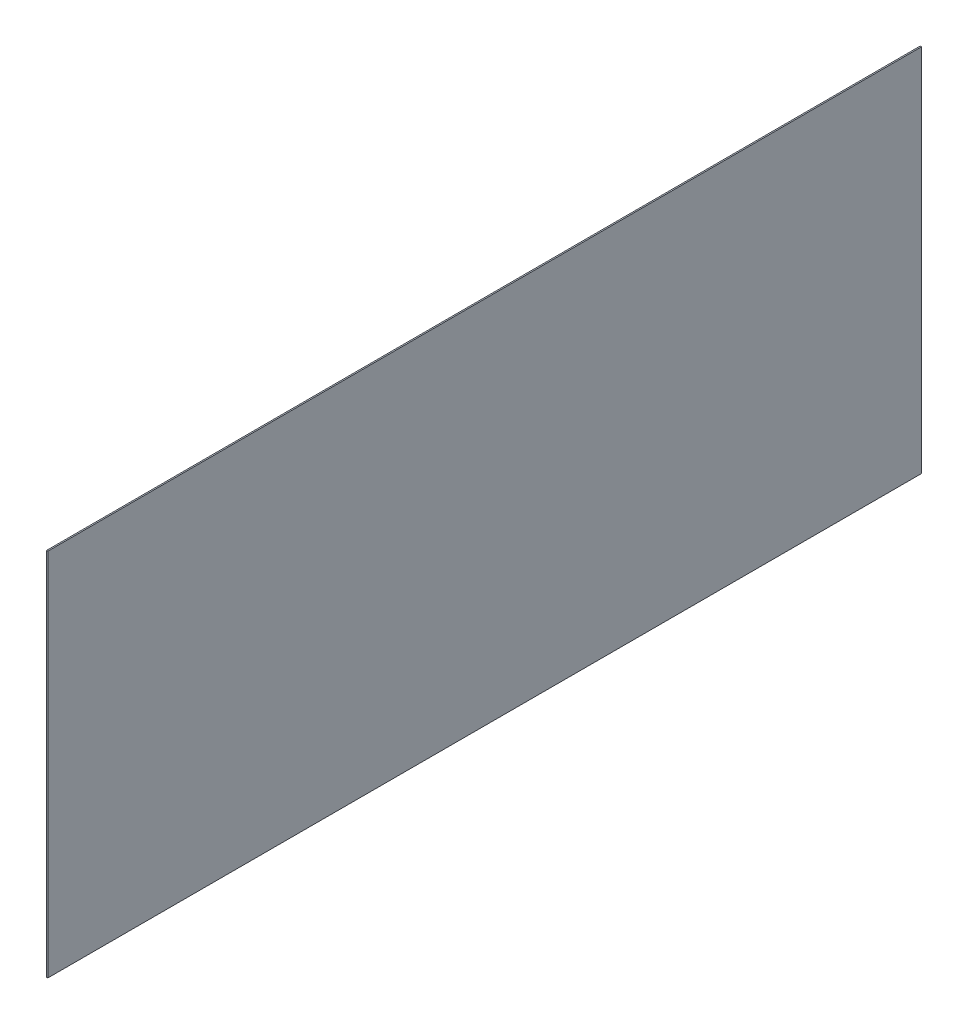
ISO-10303-21;
HEADER;
FILE_DESCRIPTION(('STEP AP214'),'2;1');
FILE_NAME('part.step','',(''),(''),'','','');
FILE_SCHEMA(('AUTOMOTIVE_DESIGN { 1 0 10303 214 1 1 1 1 }'));
ENDSEC;
DATA;
#1=APPLICATION_CONTEXT('core data for automotive mechanical design processes');
#2=APPLICATION_PROTOCOL_DEFINITION('international standard','automotive_design',2000,#1);
#3=PRODUCT_CONTEXT('',#1,'mechanical');
#4=PRODUCT('Part','Part','',(#3));
#5=PRODUCT_RELATED_PRODUCT_CATEGORY('part','',(#4));
#6=PRODUCT_DEFINITION_FORMATION('','',#4);
#7=PRODUCT_DEFINITION_CONTEXT('part definition',#1,'design');
#8=PRODUCT_DEFINITION('design','',#6,#7);
#9=PRODUCT_DEFINITION_SHAPE('','',#8);
#10=(LENGTH_UNIT() NAMED_UNIT(*) SI_UNIT(.MILLI.,.METRE.));
#11=(NAMED_UNIT(*) PLANE_ANGLE_UNIT() SI_UNIT($,.RADIAN.));
#12=(NAMED_UNIT(*) SI_UNIT($,.STERADIAN.) SOLID_ANGLE_UNIT());
#13=UNCERTAINTY_MEASURE_WITH_UNIT(LENGTH_MEASURE(1.E-05),#10,'distance_accuracy_value','');
#14=(GEOMETRIC_REPRESENTATION_CONTEXT(3) GLOBAL_UNCERTAINTY_ASSIGNED_CONTEXT((#13)) GLOBAL_UNIT_ASSIGNED_CONTEXT((#10,
#11,#12)) REPRESENTATION_CONTEXT('',''));
#15=CARTESIAN_POINT('',(0.,0.,0.));
#16=DIRECTION('',(0.,0.,1.));
#17=DIRECTION('',(1.,0.,0.));
#18=AXIS2_PLACEMENT_3D('',#15,#16,#17);
#19=CARTESIAN_POINT('',(99.95,21.3610949304939,-23.1263772325031));
#20=DIRECTION('',(0.,0.,1.));
#21=DIRECTION('',(1.,0.,0.));
#22=AXIS2_PLACEMENT_3D('',#19,#20,#21);
#23=PLANE('',#22);
#24=DIRECTION('',(0.,-1.,0.));
#25=VECTOR('',#24,1.);
#26=CARTESIAN_POINT('',(100.05,21.3610949304939,-23.1263772325031));
#27=LINE('',#26,#25);
#28=CARTESIAN_POINT('',(100.05,21.3610949304939,-23.1263772325031));
#29=VERTEX_POINT('',#28);
#30=CARTESIAN_POINT('',(100.05,-6.93992942841096,-23.1263772325031));
#31=VERTEX_POINT('',#30);
#32=EDGE_CURVE('E98',#29,#31,#27,.T.);
#33=ORIENTED_EDGE('',*,*,#32,.T.);
#34=DIRECTION('',(1.,0.,0.));
#35=VECTOR('',#34,1.);
#36=CARTESIAN_POINT('',(99.95,-6.93992942841096,-23.1263772325031));
#37=LINE('',#36,#35);
#38=CARTESIAN_POINT('',(99.95,-6.93992942841096,-23.1263772325031));
#39=VERTEX_POINT('',#38);
#40=EDGE_CURVE('E11',#39,#31,#37,.T.);
#41=ORIENTED_EDGE('',*,*,#40,.F.);
#42=DIRECTION('',(0.,-1.,0.));
#43=VECTOR('',#42,1.);
#44=CARTESIAN_POINT('',(99.95,21.3610949304939,-23.1263772325031));
#45=LINE('',#44,#43);
#46=CARTESIAN_POINT('',(99.95,21.3610949304939,-23.1263772325031));
#47=VERTEX_POINT('',#46);
#48=EDGE_CURVE('E86',#47,#39,#45,.T.);
#49=ORIENTED_EDGE('',*,*,#48,.F.);
#50=DIRECTION('',(1.,0.,0.));
#51=VECTOR('',#50,1.);
#52=CARTESIAN_POINT('',(99.95,21.3610949304939,-23.1263772325031));
#53=LINE('',#52,#51);
#54=EDGE_CURVE('E94',#47,#29,#53,.T.);
#55=ORIENTED_EDGE('',*,*,#54,.T.);
#56=EDGE_LOOP('',(#33,#41,#49,#55));
#57=FACE_BOUND('',#56,.T.);
#58=ADVANCED_FACE('F35',(#57),#23,.F.);
#59=CARTESIAN_POINT('',(99.95,-6.93992942841096,-23.1263772325031));
#60=DIRECTION('',(0.,1.,0.));
#61=DIRECTION('',(0.,0.,1.));
#62=AXIS2_PLACEMENT_3D('',#59,#60,#61);
#63=PLANE('',#62);
#64=DIRECTION('',(0.,0.,1.));
#65=VECTOR('',#64,1.);
#66=CARTESIAN_POINT('',(100.05,-6.93992942841096,-23.1263772325031));
#67=LINE('',#66,#65);
#68=CARTESIAN_POINT('',(100.05,-6.93992942841096,43.7777180092596));
#69=VERTEX_POINT('',#68);
#70=EDGE_CURVE('E90',#31,#69,#67,.T.);
#71=ORIENTED_EDGE('',*,*,#70,.T.);
#72=DIRECTION('',(1.,0.,0.));
#73=VECTOR('',#72,1.);
#74=CARTESIAN_POINT('',(99.95,-6.93992942841096,43.7777180092596));
#75=LINE('',#74,#73);
#76=CARTESIAN_POINT('',(99.95,-6.93992942841096,43.7777180092596));
#77=VERTEX_POINT('',#76);
#78=EDGE_CURVE('E43',#77,#69,#75,.T.);
#79=ORIENTED_EDGE('',*,*,#78,.F.);
#80=DIRECTION('',(0.,0.,1.));
#81=VECTOR('',#80,1.);
#82=CARTESIAN_POINT('',(99.95,-6.93992942841096,-23.1263772325031));
#83=LINE('',#82,#81);
#84=EDGE_CURVE('E81',#39,#77,#83,.T.);
#85=ORIENTED_EDGE('',*,*,#84,.F.);
#86=ORIENTED_EDGE('',*,*,#40,.T.);
#87=EDGE_LOOP('',(#71,#79,#85,#86));
#88=FACE_BOUND('',#87,.T.);
#89=ADVANCED_FACE('F89',(#88),#63,.F.);
#90=CARTESIAN_POINT('',(99.95,21.3610949304939,43.7777180092596));
#91=DIRECTION('',(0.,0.,-1.));
#92=DIRECTION('',(0.,1.,0.));
#93=AXIS2_PLACEMENT_3D('',#90,#91,#92);
#94=PLANE('',#93);
#95=DIRECTION('',(0.,1.,0.));
#96=VECTOR('',#95,1.);
#97=CARTESIAN_POINT('',(100.05,21.3610949304939,43.7777180092596));
#98=LINE('',#97,#96);
#99=CARTESIAN_POINT('',(100.05,21.3610949304939,43.7777180092596));
#100=VERTEX_POINT('',#99);
#101=EDGE_CURVE('E68',#69,#100,#98,.T.);
#102=ORIENTED_EDGE('',*,*,#101,.T.);
#103=DIRECTION('',(1.,0.,0.));
#104=VECTOR('',#103,1.);
#105=CARTESIAN_POINT('',(99.95,21.3610949304939,43.7777180092596));
#106=LINE('',#105,#104);
#107=CARTESIAN_POINT('',(99.95,21.3610949304939,43.7777180092596));
#108=VERTEX_POINT('',#107);
#109=EDGE_CURVE('E91',#108,#100,#106,.T.);
#110=ORIENTED_EDGE('',*,*,#109,.F.);
#111=DIRECTION('',(0.,1.,0.));
#112=VECTOR('',#111,1.);
#113=CARTESIAN_POINT('',(99.95,21.3610949304939,43.7777180092596));
#114=LINE('',#113,#112);
#115=EDGE_CURVE('E84',#77,#108,#114,.T.);
#116=ORIENTED_EDGE('',*,*,#115,.F.);
#117=ORIENTED_EDGE('',*,*,#78,.T.);
#118=EDGE_LOOP('',(#102,#110,#116,#117));
#119=FACE_BOUND('',#118,.T.);
#120=ADVANCED_FACE('F92',(#119),#94,.F.);
#121=CARTESIAN_POINT('',(99.95,21.3610949304939,-23.1263772325031));
#122=DIRECTION('',(0.,-1.,0.));
#123=DIRECTION('',(0.,0.,-1.));
#124=AXIS2_PLACEMENT_3D('',#121,#122,#123);
#125=PLANE('',#124);
#126=DIRECTION('',(0.,0.,-1.));
#127=VECTOR('',#126,1.);
#128=CARTESIAN_POINT('',(100.05,21.3610949304939,-23.1263772325031));
#129=LINE('',#128,#127);
#130=EDGE_CURVE('E74',#100,#29,#129,.T.);
#131=ORIENTED_EDGE('',*,*,#130,.T.);
#132=ORIENTED_EDGE('',*,*,#54,.F.);
#133=DIRECTION('',(0.,0.,-1.));
#134=VECTOR('',#133,1.);
#135=CARTESIAN_POINT('',(99.95,21.3610949304939,-23.1263772325031));
#136=LINE('',#135,#134);
#137=EDGE_CURVE('E51',#108,#47,#136,.T.);
#138=ORIENTED_EDGE('',*,*,#137,.F.);
#139=ORIENTED_EDGE('',*,*,#109,.T.);
#140=EDGE_LOOP('',(#131,#132,#138,#139));
#141=FACE_BOUND('',#140,.T.);
#142=ADVANCED_FACE('F105',(#141),#125,.F.);
#143=CARTESIAN_POINT('',(99.95,0.,0.));
#144=DIRECTION('',(-1.,0.,0.));
#145=DIRECTION('',(0.,0.,1.));
#146=AXIS2_PLACEMENT_3D('',#143,#144,#145);
#147=PLANE('',#146);
#148=ORIENTED_EDGE('',*,*,#48,.T.);
#149=ORIENTED_EDGE('',*,*,#84,.T.);
#150=ORIENTED_EDGE('',*,*,#115,.T.);
#151=ORIENTED_EDGE('',*,*,#137,.T.);
#152=EDGE_LOOP('',(#148,#149,#150,#151));
#153=FACE_BOUND('',#152,.T.);
#154=ADVANCED_FACE('F82',(#153),#147,.T.);
#155=CARTESIAN_POINT('',(100.05,0.,0.));
#156=DIRECTION('',(-1.,0.,0.));
#157=DIRECTION('',(0.,0.,1.));
#158=AXIS2_PLACEMENT_3D('',#155,#156,#157);
#159=PLANE('',#158);
#160=ORIENTED_EDGE('',*,*,#32,.F.);
#161=ORIENTED_EDGE('',*,*,#130,.F.);
#162=ORIENTED_EDGE('',*,*,#101,.F.);
#163=ORIENTED_EDGE('',*,*,#70,.F.);
#164=EDGE_LOOP('',(#160,#161,#162,#163));
#165=FACE_BOUND('',#164,.T.);
#166=ADVANCED_FACE('F108',(#165),#159,.F.);
#167=CLOSED_SHELL('',(#58,#89,#120,#142,#154,#166));
#168=MANIFOLD_SOLID_BREP('B2',#167);
#169=ADVANCED_BREP_SHAPE_REPRESENTATION('',(#18,#168),#14);
#170=SHAPE_DEFINITION_REPRESENTATION(#9,#169);
ENDSEC;
END-ISO-10303-21;
